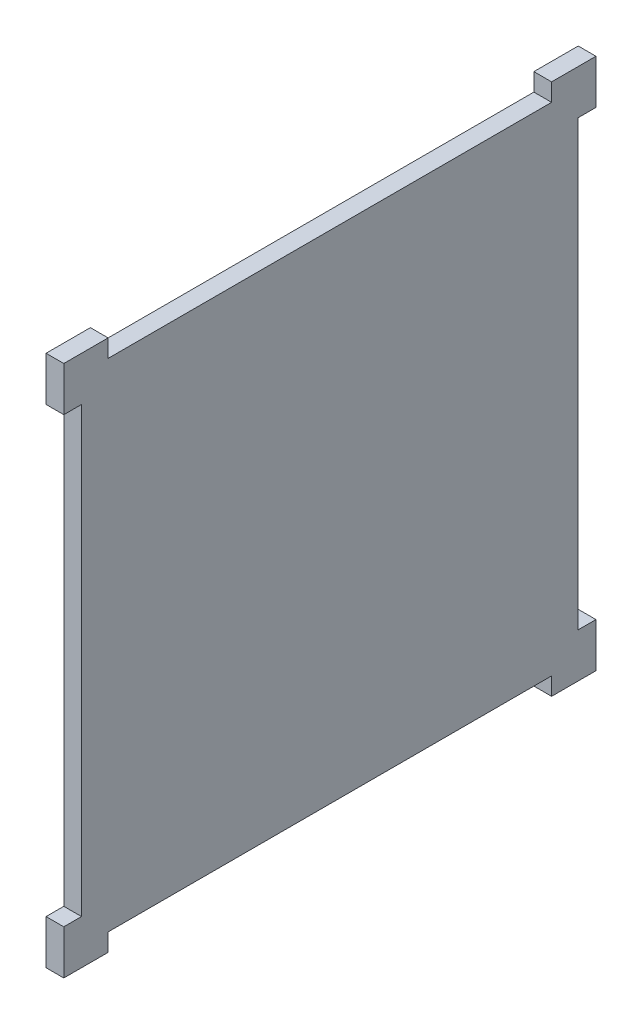
ISO-10303-21;
HEADER;
FILE_DESCRIPTION(('STEP AP214'),'2;1');
FILE_NAME('part.step','',(''),(''),'','','');
FILE_SCHEMA(('AUTOMOTIVE_DESIGN { 1 0 10303 214 1 1 1 1 }'));
ENDSEC;
DATA;
#1=APPLICATION_CONTEXT('core data for automotive mechanical design processes');
#2=APPLICATION_PROTOCOL_DEFINITION('international standard','automotive_design',2000,#1);
#3=PRODUCT_CONTEXT('',#1,'mechanical');
#4=PRODUCT('Part','Part','',(#3));
#5=PRODUCT_RELATED_PRODUCT_CATEGORY('part','',(#4));
#6=PRODUCT_DEFINITION_FORMATION('','',#4);
#7=PRODUCT_DEFINITION_CONTEXT('part definition',#1,'design');
#8=PRODUCT_DEFINITION('design','',#6,#7);
#9=PRODUCT_DEFINITION_SHAPE('','',#8);
#10=(LENGTH_UNIT() NAMED_UNIT(*) SI_UNIT(.MILLI.,.METRE.));
#11=(NAMED_UNIT(*) PLANE_ANGLE_UNIT() SI_UNIT($,.RADIAN.));
#12=(NAMED_UNIT(*) SI_UNIT($,.STERADIAN.) SOLID_ANGLE_UNIT());
#13=UNCERTAINTY_MEASURE_WITH_UNIT(LENGTH_MEASURE(1.E-05),#10,'distance_accuracy_value','');
#14=(GEOMETRIC_REPRESENTATION_CONTEXT(3) GLOBAL_UNCERTAINTY_ASSIGNED_CONTEXT((#13)) GLOBAL_UNIT_ASSIGNED_CONTEXT((#10,
#11,#12)) REPRESENTATION_CONTEXT('',''));
#15=CARTESIAN_POINT('',(0.,0.,0.));
#16=DIRECTION('',(0.,0.,1.));
#17=DIRECTION('',(1.,0.,0.));
#18=AXIS2_PLACEMENT_3D('',#15,#16,#17);
#19=CARTESIAN_POINT('',(5.08,63.5,-76.2));
#20=DIRECTION('',(0.,0.,1.));
#21=DIRECTION('',(0.,-1.,0.));
#22=AXIS2_PLACEMENT_3D('',#19,#20,#21);
#23=PLANE('',#22);
#24=DIRECTION('',(0.,1.,0.));
#25=VECTOR('',#24,1.);
#26=CARTESIAN_POINT('',(0.,63.5,-76.2));
#27=LINE('',#26,#25);
#28=CARTESIAN_POINT('',(0.,63.5,-76.2));
#29=VERTEX_POINT('',#28);
#30=CARTESIAN_POINT('',(0.,76.2,-76.2));
#31=VERTEX_POINT('',#30);
#32=EDGE_CURVE('E201',#29,#31,#27,.T.);
#33=ORIENTED_EDGE('',*,*,#32,.T.);
#34=DIRECTION('',(-1.,0.,0.));
#35=VECTOR('',#34,1.);
#36=CARTESIAN_POINT('',(5.08,76.2,-76.2));
#37=LINE('',#36,#35);
#38=CARTESIAN_POINT('',(5.08,76.2,-76.2));
#39=VERTEX_POINT('',#38);
#40=EDGE_CURVE('E11',#39,#31,#37,.T.);
#41=ORIENTED_EDGE('',*,*,#40,.F.);
#42=DIRECTION('',(0.,1.,0.));
#43=VECTOR('',#42,1.);
#44=CARTESIAN_POINT('',(5.08,63.5,-76.2));
#45=LINE('',#44,#43);
#46=CARTESIAN_POINT('',(5.08,63.5,-76.2));
#47=VERTEX_POINT('',#46);
#48=EDGE_CURVE('E239',#47,#39,#45,.T.);
#49=ORIENTED_EDGE('',*,*,#48,.F.);
#50=DIRECTION('',(-1.,0.,0.));
#51=VECTOR('',#50,1.);
#52=CARTESIAN_POINT('',(5.08,63.5,-76.2));
#53=LINE('',#52,#51);
#54=EDGE_CURVE('E197',#47,#29,#53,.T.);
#55=ORIENTED_EDGE('',*,*,#54,.T.);
#56=EDGE_LOOP('',(#33,#41,#49,#55));
#57=FACE_BOUND('',#56,.T.);
#58=ADVANCED_FACE('F33',(#57),#23,.F.);
#59=CARTESIAN_POINT('',(5.08,76.2,-63.5));
#60=DIRECTION('',(0.,-1.,0.));
#61=DIRECTION('',(0.,0.,-1.));
#62=AXIS2_PLACEMENT_3D('',#59,#60,#61);
#63=PLANE('',#62);
#64=DIRECTION('',(0.,0.,1.));
#65=VECTOR('',#64,1.);
#66=CARTESIAN_POINT('',(0.,76.2,-63.5));
#67=LINE('',#66,#65);
#68=CARTESIAN_POINT('',(0.,76.2,-63.5));
#69=VERTEX_POINT('',#68);
#70=EDGE_CURVE('E204',#31,#69,#67,.T.);
#71=ORIENTED_EDGE('',*,*,#70,.T.);
#72=DIRECTION('',(-1.,0.,0.));
#73=VECTOR('',#72,1.);
#74=CARTESIAN_POINT('',(5.08,76.2,-63.5));
#75=LINE('',#74,#73);
#76=CARTESIAN_POINT('',(5.08,76.2,-63.5));
#77=VERTEX_POINT('',#76);
#78=EDGE_CURVE('E41',#77,#69,#75,.T.);
#79=ORIENTED_EDGE('',*,*,#78,.F.);
#80=DIRECTION('',(0.,0.,1.));
#81=VECTOR('',#80,1.);
#82=CARTESIAN_POINT('',(5.08,76.2,-63.5));
#83=LINE('',#82,#81);
#84=EDGE_CURVE('E128',#39,#77,#83,.T.);
#85=ORIENTED_EDGE('',*,*,#84,.F.);
#86=ORIENTED_EDGE('',*,*,#40,.T.);
#87=EDGE_LOOP('',(#71,#79,#85,#86));
#88=FACE_BOUND('',#87,.T.);
#89=ADVANCED_FACE('F357',(#88),#63,.F.);
#90=CARTESIAN_POINT('',(5.08,76.2,-63.5));
#91=DIRECTION('',(0.,0.,-1.));
#92=DIRECTION('',(-1.,0.,0.));
#93=AXIS2_PLACEMENT_3D('',#90,#91,#92);
#94=PLANE('',#93);
#95=DIRECTION('',(0.,-1.,0.));
#96=VECTOR('',#95,1.);
#97=CARTESIAN_POINT('',(0.,76.2,-63.5));
#98=LINE('',#97,#96);
#99=CARTESIAN_POINT('',(0.,71.12,-63.5));
#100=VERTEX_POINT('',#99);
#101=EDGE_CURVE('E206',#69,#100,#98,.T.);
#102=ORIENTED_EDGE('',*,*,#101,.T.);
#103=DIRECTION('',(-1.,0.,0.));
#104=VECTOR('',#103,1.);
#105=CARTESIAN_POINT('',(5.08,71.12,-63.5));
#106=LINE('',#105,#104);
#107=CARTESIAN_POINT('',(5.08,71.12,-63.5));
#108=VERTEX_POINT('',#107);
#109=EDGE_CURVE('E282',#108,#100,#106,.T.);
#110=ORIENTED_EDGE('',*,*,#109,.F.);
#111=DIRECTION('',(0.,-1.,0.));
#112=VECTOR('',#111,1.);
#113=CARTESIAN_POINT('',(5.08,76.2,-63.5));
#114=LINE('',#113,#112);
#115=EDGE_CURVE('E290',#77,#108,#114,.T.);
#116=ORIENTED_EDGE('',*,*,#115,.F.);
#117=ORIENTED_EDGE('',*,*,#78,.T.);
#118=EDGE_LOOP('',(#102,#110,#116,#117));
#119=FACE_BOUND('',#118,.T.);
#120=ADVANCED_FACE('F288',(#119),#94,.F.);
#121=CARTESIAN_POINT('',(5.08,71.12,63.5));
#122=DIRECTION('',(0.,-1.,0.));
#123=DIRECTION('',(0.,0.,-1.));
#124=AXIS2_PLACEMENT_3D('',#121,#122,#123);
#125=PLANE('',#124);
#126=DIRECTION('',(0.,0.,1.));
#127=VECTOR('',#126,1.);
#128=CARTESIAN_POINT('',(0.,71.12,63.5));
#129=LINE('',#128,#127);
#130=CARTESIAN_POINT('',(0.,71.12,63.5));
#131=VERTEX_POINT('',#130);
#132=EDGE_CURVE('E208',#100,#131,#129,.T.);
#133=ORIENTED_EDGE('',*,*,#132,.T.);
#134=DIRECTION('',(-1.,0.,0.));
#135=VECTOR('',#134,1.);
#136=CARTESIAN_POINT('',(5.08,71.12,63.5));
#137=LINE('',#136,#135);
#138=CARTESIAN_POINT('',(5.08,71.12,63.5));
#139=VERTEX_POINT('',#138);
#140=EDGE_CURVE('E279',#139,#131,#137,.T.);
#141=ORIENTED_EDGE('',*,*,#140,.F.);
#142=DIRECTION('',(0.,0.,1.));
#143=VECTOR('',#142,1.);
#144=CARTESIAN_POINT('',(5.08,71.12,63.5));
#145=LINE('',#144,#143);
#146=EDGE_CURVE('E308',#108,#139,#145,.T.);
#147=ORIENTED_EDGE('',*,*,#146,.F.);
#148=ORIENTED_EDGE('',*,*,#109,.T.);
#149=EDGE_LOOP('',(#133,#141,#147,#148));
#150=FACE_BOUND('',#149,.T.);
#151=ADVANCED_FACE('F299',(#150),#125,.F.);
#152=CARTESIAN_POINT('',(5.08,76.2,63.5));
#153=DIRECTION('',(0.,0.,1.));
#154=DIRECTION('',(1.,0.,0.));
#155=AXIS2_PLACEMENT_3D('',#152,#153,#154);
#156=PLANE('',#155);
#157=DIRECTION('',(0.,1.,0.));
#158=VECTOR('',#157,1.);
#159=CARTESIAN_POINT('',(0.,76.2,63.5));
#160=LINE('',#159,#158);
#161=CARTESIAN_POINT('',(0.,76.2,63.5));
#162=VERTEX_POINT('',#161);
#163=EDGE_CURVE('E210',#131,#162,#160,.T.);
#164=ORIENTED_EDGE('',*,*,#163,.T.);
#165=DIRECTION('',(-1.,0.,0.));
#166=VECTOR('',#165,1.);
#167=CARTESIAN_POINT('',(5.08,76.2,63.5));
#168=LINE('',#167,#166);
#169=CARTESIAN_POINT('',(5.08,76.2,63.5));
#170=VERTEX_POINT('',#169);
#171=EDGE_CURVE('E276',#170,#162,#168,.T.);
#172=ORIENTED_EDGE('',*,*,#171,.F.);
#173=DIRECTION('',(0.,1.,0.));
#174=VECTOR('',#173,1.);
#175=CARTESIAN_POINT('',(5.08,76.2,63.5));
#176=LINE('',#175,#174);
#177=EDGE_CURVE('E305',#139,#170,#176,.T.);
#178=ORIENTED_EDGE('',*,*,#177,.F.);
#179=ORIENTED_EDGE('',*,*,#140,.T.);
#180=EDGE_LOOP('',(#164,#172,#178,#179));
#181=FACE_BOUND('',#180,.T.);
#182=ADVANCED_FACE('F303',(#181),#156,.F.);
#183=CARTESIAN_POINT('',(5.08,76.2,76.2));
#184=DIRECTION('',(0.,-1.,0.));
#185=DIRECTION('',(0.,0.,-1.));
#186=AXIS2_PLACEMENT_3D('',#183,#184,#185);
#187=PLANE('',#186);
#188=DIRECTION('',(0.,0.,1.));
#189=VECTOR('',#188,1.);
#190=CARTESIAN_POINT('',(0.,76.2,76.2));
#191=LINE('',#190,#189);
#192=CARTESIAN_POINT('',(0.,76.2,76.2));
#193=VERTEX_POINT('',#192);
#194=EDGE_CURVE('E212',#162,#193,#191,.T.);
#195=ORIENTED_EDGE('',*,*,#194,.T.);
#196=DIRECTION('',(-1.,0.,0.));
#197=VECTOR('',#196,1.);
#198=CARTESIAN_POINT('',(5.08,76.2,76.2));
#199=LINE('',#198,#197);
#200=CARTESIAN_POINT('',(5.08,76.2,76.2));
#201=VERTEX_POINT('',#200);
#202=EDGE_CURVE('E273',#201,#193,#199,.T.);
#203=ORIENTED_EDGE('',*,*,#202,.F.);
#204=DIRECTION('',(0.,0.,1.));
#205=VECTOR('',#204,1.);
#206=CARTESIAN_POINT('',(5.08,76.2,76.2));
#207=LINE('',#206,#205);
#208=EDGE_CURVE('E307',#170,#201,#207,.T.);
#209=ORIENTED_EDGE('',*,*,#208,.F.);
#210=ORIENTED_EDGE('',*,*,#171,.T.);
#211=EDGE_LOOP('',(#195,#203,#209,#210));
#212=FACE_BOUND('',#211,.T.);
#213=ADVANCED_FACE('F370',(#212),#187,.F.);
#214=CARTESIAN_POINT('',(5.08,63.5,76.2));
#215=DIRECTION('',(0.,0.,-1.));
#216=DIRECTION('',(-1.,0.,0.));
#217=AXIS2_PLACEMENT_3D('',#214,#215,#216);
#218=PLANE('',#217);
#219=DIRECTION('',(0.,-1.,0.));
#220=VECTOR('',#219,1.);
#221=CARTESIAN_POINT('',(0.,63.5,76.2));
#222=LINE('',#221,#220);
#223=CARTESIAN_POINT('',(0.,63.5,76.2));
#224=VERTEX_POINT('',#223);
#225=EDGE_CURVE('E214',#193,#224,#222,.T.);
#226=ORIENTED_EDGE('',*,*,#225,.T.);
#227=DIRECTION('',(-1.,0.,0.));
#228=VECTOR('',#227,1.);
#229=CARTESIAN_POINT('',(5.08,63.5,76.2));
#230=LINE('',#229,#228);
#231=CARTESIAN_POINT('',(5.08,63.5,76.2));
#232=VERTEX_POINT('',#231);
#233=EDGE_CURVE('E270',#232,#224,#230,.T.);
#234=ORIENTED_EDGE('',*,*,#233,.F.);
#235=DIRECTION('',(0.,-1.,0.));
#236=VECTOR('',#235,1.);
#237=CARTESIAN_POINT('',(5.08,63.5,76.2));
#238=LINE('',#237,#236);
#239=EDGE_CURVE('E310',#201,#232,#238,.T.);
#240=ORIENTED_EDGE('',*,*,#239,.F.);
#241=ORIENTED_EDGE('',*,*,#202,.T.);
#242=EDGE_LOOP('',(#226,#234,#240,#241));
#243=FACE_BOUND('',#242,.T.);
#244=ADVANCED_FACE('F373',(#243),#218,.F.);
#245=CARTESIAN_POINT('',(5.08,63.5,76.2));
#246=DIRECTION('',(0.,1.,0.));
#247=DIRECTION('',(0.,0.,1.));
#248=AXIS2_PLACEMENT_3D('',#245,#246,#247);
#249=PLANE('',#248);
#250=DIRECTION('',(0.,0.,-1.));
#251=VECTOR('',#250,1.);
#252=CARTESIAN_POINT('',(0.,63.5,76.2));
#253=LINE('',#252,#251);
#254=CARTESIAN_POINT('',(0.,63.5,71.12));
#255=VERTEX_POINT('',#254);
#256=EDGE_CURVE('E216',#224,#255,#253,.T.);
#257=ORIENTED_EDGE('',*,*,#256,.T.);
#258=DIRECTION('',(-1.,0.,0.));
#259=VECTOR('',#258,1.);
#260=CARTESIAN_POINT('',(5.08,63.5,71.12));
#261=LINE('',#260,#259);
#262=CARTESIAN_POINT('',(5.08,63.5,71.12));
#263=VERTEX_POINT('',#262);
#264=EDGE_CURVE('E267',#263,#255,#261,.T.);
#265=ORIENTED_EDGE('',*,*,#264,.F.);
#266=DIRECTION('',(0.,0.,-1.));
#267=VECTOR('',#266,1.);
#268=CARTESIAN_POINT('',(5.08,63.5,76.2));
#269=LINE('',#268,#267);
#270=EDGE_CURVE('E316',#232,#263,#269,.T.);
#271=ORIENTED_EDGE('',*,*,#270,.F.);
#272=ORIENTED_EDGE('',*,*,#233,.T.);
#273=EDGE_LOOP('',(#257,#265,#271,#272));
#274=FACE_BOUND('',#273,.T.);
#275=ADVANCED_FACE('F377',(#274),#249,.F.);
#276=CARTESIAN_POINT('',(5.08,-63.5,71.12));
#277=DIRECTION('',(0.,0.,-1.));
#278=DIRECTION('',(0.,1.,0.));
#279=AXIS2_PLACEMENT_3D('',#276,#277,#278);
#280=PLANE('',#279);
#281=DIRECTION('',(0.,-1.,0.));
#282=VECTOR('',#281,1.);
#283=CARTESIAN_POINT('',(0.,-63.5,71.12));
#284=LINE('',#283,#282);
#285=CARTESIAN_POINT('',(0.,-63.5,71.12));
#286=VERTEX_POINT('',#285);
#287=EDGE_CURVE('E218',#255,#286,#284,.T.);
#288=ORIENTED_EDGE('',*,*,#287,.T.);
#289=DIRECTION('',(-1.,0.,0.));
#290=VECTOR('',#289,1.);
#291=CARTESIAN_POINT('',(5.08,-63.5,71.12));
#292=LINE('',#291,#290);
#293=CARTESIAN_POINT('',(5.08,-63.5,71.12));
#294=VERTEX_POINT('',#293);
#295=EDGE_CURVE('E264',#294,#286,#292,.T.);
#296=ORIENTED_EDGE('',*,*,#295,.F.);
#297=DIRECTION('',(0.,-1.,0.));
#298=VECTOR('',#297,1.);
#299=CARTESIAN_POINT('',(5.08,-63.5,71.12));
#300=LINE('',#299,#298);
#301=EDGE_CURVE('E318',#263,#294,#300,.T.);
#302=ORIENTED_EDGE('',*,*,#301,.F.);
#303=ORIENTED_EDGE('',*,*,#264,.T.);
#304=EDGE_LOOP('',(#288,#296,#302,#303));
#305=FACE_BOUND('',#304,.T.);
#306=ADVANCED_FACE('F381',(#305),#280,.F.);
#307=CARTESIAN_POINT('',(5.08,-63.5,76.2));
#308=DIRECTION('',(0.,-1.,0.));
#309=DIRECTION('',(0.,0.,-1.));
#310=AXIS2_PLACEMENT_3D('',#307,#308,#309);
#311=PLANE('',#310);
#312=DIRECTION('',(0.,0.,1.));
#313=VECTOR('',#312,1.);
#314=CARTESIAN_POINT('',(0.,-63.5,76.2));
#315=LINE('',#314,#313);
#316=CARTESIAN_POINT('',(0.,-63.5,76.2));
#317=VERTEX_POINT('',#316);
#318=EDGE_CURVE('E220',#286,#317,#315,.T.);
#319=ORIENTED_EDGE('',*,*,#318,.T.);
#320=DIRECTION('',(-1.,0.,0.));
#321=VECTOR('',#320,1.);
#322=CARTESIAN_POINT('',(5.08,-63.5,76.2));
#323=LINE('',#322,#321);
#324=CARTESIAN_POINT('',(5.08,-63.5,76.2));
#325=VERTEX_POINT('',#324);
#326=EDGE_CURVE('E261',#325,#317,#323,.T.);
#327=ORIENTED_EDGE('',*,*,#326,.F.);
#328=DIRECTION('',(0.,0.,1.));
#329=VECTOR('',#328,1.);
#330=CARTESIAN_POINT('',(5.08,-63.5,76.2));
#331=LINE('',#330,#329);
#332=EDGE_CURVE('E320',#294,#325,#331,.T.);
#333=ORIENTED_EDGE('',*,*,#332,.F.);
#334=ORIENTED_EDGE('',*,*,#295,.T.);
#335=EDGE_LOOP('',(#319,#327,#333,#334));
#336=FACE_BOUND('',#335,.T.);
#337=ADVANCED_FACE('F385',(#336),#311,.F.);
#338=CARTESIAN_POINT('',(5.08,-76.2,76.2));
#339=DIRECTION('',(0.,0.,-1.));
#340=DIRECTION('',(0.,1.,0.));
#341=AXIS2_PLACEMENT_3D('',#338,#339,#340);
#342=PLANE('',#341);
#343=DIRECTION('',(0.,-1.,0.));
#344=VECTOR('',#343,1.);
#345=CARTESIAN_POINT('',(0.,-76.2,76.2));
#346=LINE('',#345,#344);
#347=CARTESIAN_POINT('',(0.,-76.2,76.2));
#348=VERTEX_POINT('',#347);
#349=EDGE_CURVE('E222',#317,#348,#346,.T.);
#350=ORIENTED_EDGE('',*,*,#349,.T.);
#351=DIRECTION('',(-1.,0.,0.));
#352=VECTOR('',#351,1.);
#353=CARTESIAN_POINT('',(5.08,-76.2,76.2));
#354=LINE('',#353,#352);
#355=CARTESIAN_POINT('',(5.08,-76.2,76.2));
#356=VERTEX_POINT('',#355);
#357=EDGE_CURVE('E258',#356,#348,#354,.T.);
#358=ORIENTED_EDGE('',*,*,#357,.F.);
#359=DIRECTION('',(0.,-1.,0.));
#360=VECTOR('',#359,1.);
#361=CARTESIAN_POINT('',(5.08,-76.2,76.2));
#362=LINE('',#361,#360);
#363=EDGE_CURVE('E322',#325,#356,#362,.T.);
#364=ORIENTED_EDGE('',*,*,#363,.F.);
#365=ORIENTED_EDGE('',*,*,#326,.T.);
#366=EDGE_LOOP('',(#350,#358,#364,#365));
#367=FACE_BOUND('',#366,.T.);
#368=ADVANCED_FACE('F389',(#367),#342,.F.);
#369=CARTESIAN_POINT('',(5.08,-76.2,76.2));
#370=DIRECTION('',(0.,1.,0.));
#371=DIRECTION('',(0.,0.,1.));
#372=AXIS2_PLACEMENT_3D('',#369,#370,#371);
#373=PLANE('',#372);
#374=DIRECTION('',(0.,0.,-1.));
#375=VECTOR('',#374,1.);
#376=CARTESIAN_POINT('',(0.,-76.2,76.2));
#377=LINE('',#376,#375);
#378=CARTESIAN_POINT('',(0.,-76.2,63.5));
#379=VERTEX_POINT('',#378);
#380=EDGE_CURVE('E224',#348,#379,#377,.T.);
#381=ORIENTED_EDGE('',*,*,#380,.T.);
#382=DIRECTION('',(-1.,0.,0.));
#383=VECTOR('',#382,1.);
#384=CARTESIAN_POINT('',(5.08,-76.2,63.5));
#385=LINE('',#384,#383);
#386=CARTESIAN_POINT('',(5.08,-76.2,63.5));
#387=VERTEX_POINT('',#386);
#388=EDGE_CURVE('E255',#387,#379,#385,.T.);
#389=ORIENTED_EDGE('',*,*,#388,.F.);
#390=DIRECTION('',(0.,0.,-1.));
#391=VECTOR('',#390,1.);
#392=CARTESIAN_POINT('',(5.08,-76.2,76.2));
#393=LINE('',#392,#391);
#394=EDGE_CURVE('E324',#356,#387,#393,.T.);
#395=ORIENTED_EDGE('',*,*,#394,.F.);
#396=ORIENTED_EDGE('',*,*,#357,.T.);
#397=EDGE_LOOP('',(#381,#389,#395,#396));
#398=FACE_BOUND('',#397,.T.);
#399=ADVANCED_FACE('F393',(#398),#373,.F.);
#400=CARTESIAN_POINT('',(5.08,-76.2,63.5));
#401=DIRECTION('',(0.,0.,1.));
#402=DIRECTION('',(1.,0.,0.));
#403=AXIS2_PLACEMENT_3D('',#400,#401,#402);
#404=PLANE('',#403);
#405=DIRECTION('',(0.,1.,0.));
#406=VECTOR('',#405,1.);
#407=CARTESIAN_POINT('',(0.,-76.2,63.5));
#408=LINE('',#407,#406);
#409=CARTESIAN_POINT('',(0.,-71.12,63.5));
#410=VERTEX_POINT('',#409);
#411=EDGE_CURVE('E226',#379,#410,#408,.T.);
#412=ORIENTED_EDGE('',*,*,#411,.T.);
#413=DIRECTION('',(-1.,0.,0.));
#414=VECTOR('',#413,1.);
#415=CARTESIAN_POINT('',(5.08,-71.12,63.5));
#416=LINE('',#415,#414);
#417=CARTESIAN_POINT('',(5.08,-71.12,63.5));
#418=VERTEX_POINT('',#417);
#419=EDGE_CURVE('E252',#418,#410,#416,.T.);
#420=ORIENTED_EDGE('',*,*,#419,.F.);
#421=DIRECTION('',(0.,1.,0.));
#422=VECTOR('',#421,1.);
#423=CARTESIAN_POINT('',(5.08,-76.2,63.5));
#424=LINE('',#423,#422);
#425=EDGE_CURVE('E326',#387,#418,#424,.T.);
#426=ORIENTED_EDGE('',*,*,#425,.F.);
#427=ORIENTED_EDGE('',*,*,#388,.T.);
#428=EDGE_LOOP('',(#412,#420,#426,#427));
#429=FACE_BOUND('',#428,.T.);
#430=ADVANCED_FACE('F397',(#429),#404,.F.);
#431=CARTESIAN_POINT('',(5.08,-71.12,63.5));
#432=DIRECTION('',(0.,1.,0.));
#433=DIRECTION('',(0.,0.,1.));
#434=AXIS2_PLACEMENT_3D('',#431,#432,#433);
#435=PLANE('',#434);
#436=DIRECTION('',(0.,0.,-1.));
#437=VECTOR('',#436,1.);
#438=CARTESIAN_POINT('',(0.,-71.12,63.5));
#439=LINE('',#438,#437);
#440=CARTESIAN_POINT('',(0.,-71.12,-63.4999999999999));
#441=VERTEX_POINT('',#440);
#442=EDGE_CURVE('E228',#410,#441,#439,.T.);
#443=ORIENTED_EDGE('',*,*,#442,.T.);
#444=DIRECTION('',(-1.,0.,0.));
#445=VECTOR('',#444,1.);
#446=CARTESIAN_POINT('',(5.08,-71.12,-63.4999999999999));
#447=LINE('',#446,#445);
#448=CARTESIAN_POINT('',(5.08,-71.12,-63.4999999999999));
#449=VERTEX_POINT('',#448);
#450=EDGE_CURVE('E249',#449,#441,#447,.T.);
#451=ORIENTED_EDGE('',*,*,#450,.F.);
#452=DIRECTION('',(0.,0.,-1.));
#453=VECTOR('',#452,1.);
#454=CARTESIAN_POINT('',(5.08,-71.12,63.5));
#455=LINE('',#454,#453);
#456=EDGE_CURVE('E328',#418,#449,#455,.T.);
#457=ORIENTED_EDGE('',*,*,#456,.F.);
#458=ORIENTED_EDGE('',*,*,#419,.T.);
#459=EDGE_LOOP('',(#443,#451,#457,#458));
#460=FACE_BOUND('',#459,.T.);
#461=ADVANCED_FACE('F401',(#460),#435,.F.);
#462=CARTESIAN_POINT('',(5.08,-76.2,-63.4999999999999));
#463=DIRECTION('',(0.,0.,-1.));
#464=DIRECTION('',(-1.,0.,0.));
#465=AXIS2_PLACEMENT_3D('',#462,#463,#464);
#466=PLANE('',#465);
#467=DIRECTION('',(0.,-1.,0.));
#468=VECTOR('',#467,1.);
#469=CARTESIAN_POINT('',(0.,-76.2,-63.4999999999999));
#470=LINE('',#469,#468);
#471=CARTESIAN_POINT('',(0.,-76.2,-63.4999999999999));
#472=VERTEX_POINT('',#471);
#473=EDGE_CURVE('E230',#441,#472,#470,.T.);
#474=ORIENTED_EDGE('',*,*,#473,.T.);
#475=DIRECTION('',(-1.,0.,0.));
#476=VECTOR('',#475,1.);
#477=CARTESIAN_POINT('',(5.08,-76.2,-63.4999999999999));
#478=LINE('',#477,#476);
#479=CARTESIAN_POINT('',(5.08,-76.2,-63.4999999999999));
#480=VERTEX_POINT('',#479);
#481=EDGE_CURVE('E246',#480,#472,#478,.T.);
#482=ORIENTED_EDGE('',*,*,#481,.F.);
#483=DIRECTION('',(0.,-1.,0.));
#484=VECTOR('',#483,1.);
#485=CARTESIAN_POINT('',(5.08,-76.2,-63.4999999999999));
#486=LINE('',#485,#484);
#487=EDGE_CURVE('E330',#449,#480,#486,.T.);
#488=ORIENTED_EDGE('',*,*,#487,.F.);
#489=ORIENTED_EDGE('',*,*,#450,.T.);
#490=EDGE_LOOP('',(#474,#482,#488,#489));
#491=FACE_BOUND('',#490,.T.);
#492=ADVANCED_FACE('F405',(#491),#466,.F.);
#493=CARTESIAN_POINT('',(5.08,-76.2,-63.4999999999999));
#494=DIRECTION('',(0.,1.,0.));
#495=DIRECTION('',(0.,0.,1.));
#496=AXIS2_PLACEMENT_3D('',#493,#494,#495);
#497=PLANE('',#496);
#498=DIRECTION('',(0.,0.,-1.));
#499=VECTOR('',#498,1.);
#500=CARTESIAN_POINT('',(0.,-76.2,-63.4999999999999));
#501=LINE('',#500,#499);
#502=CARTESIAN_POINT('',(0.,-76.2,-76.2));
#503=VERTEX_POINT('',#502);
#504=EDGE_CURVE('E232',#472,#503,#501,.T.);
#505=ORIENTED_EDGE('',*,*,#504,.T.);
#506=DIRECTION('',(-1.,0.,0.));
#507=VECTOR('',#506,1.);
#508=CARTESIAN_POINT('',(5.08,-76.2,-76.2));
#509=LINE('',#508,#507);
#510=CARTESIAN_POINT('',(5.08,-76.2,-76.2));
#511=VERTEX_POINT('',#510);
#512=EDGE_CURVE('E243',#511,#503,#509,.T.);
#513=ORIENTED_EDGE('',*,*,#512,.F.);
#514=DIRECTION('',(0.,0.,-1.));
#515=VECTOR('',#514,1.);
#516=CARTESIAN_POINT('',(5.08,-76.2,-63.4999999999999));
#517=LINE('',#516,#515);
#518=EDGE_CURVE('E332',#480,#511,#517,.T.);
#519=ORIENTED_EDGE('',*,*,#518,.F.);
#520=ORIENTED_EDGE('',*,*,#481,.T.);
#521=EDGE_LOOP('',(#505,#513,#519,#520));
#522=FACE_BOUND('',#521,.T.);
#523=ADVANCED_FACE('F338',(#522),#497,.F.);
#524=CARTESIAN_POINT('',(5.08,-76.2,-76.2));
#525=DIRECTION('',(0.,0.,1.));
#526=DIRECTION('',(0.,-1.,0.));
#527=AXIS2_PLACEMENT_3D('',#524,#525,#526);
#528=PLANE('',#527);
#529=DIRECTION('',(0.,1.,0.));
#530=VECTOR('',#529,1.);
#531=CARTESIAN_POINT('',(0.,-76.2,-76.2));
#532=LINE('',#531,#530);
#533=CARTESIAN_POINT('',(0.,-63.5,-76.2));
#534=VERTEX_POINT('',#533);
#535=EDGE_CURVE('E234',#503,#534,#532,.T.);
#536=ORIENTED_EDGE('',*,*,#535,.T.);
#537=DIRECTION('',(-1.,0.,0.));
#538=VECTOR('',#537,1.);
#539=CARTESIAN_POINT('',(5.08,-63.5,-76.2));
#540=LINE('',#539,#538);
#541=CARTESIAN_POINT('',(5.08,-63.5,-76.2));
#542=VERTEX_POINT('',#541);
#543=EDGE_CURVE('E192',#542,#534,#540,.T.);
#544=ORIENTED_EDGE('',*,*,#543,.F.);
#545=DIRECTION('',(0.,1.,0.));
#546=VECTOR('',#545,1.);
#547=CARTESIAN_POINT('',(5.08,-76.2,-76.2));
#548=LINE('',#547,#546);
#549=EDGE_CURVE('E183',#511,#542,#548,.T.);
#550=ORIENTED_EDGE('',*,*,#549,.F.);
#551=ORIENTED_EDGE('',*,*,#512,.T.);
#552=EDGE_LOOP('',(#536,#544,#550,#551));
#553=FACE_BOUND('',#552,.T.);
#554=ADVANCED_FACE('F342',(#553),#528,.F.);
#555=CARTESIAN_POINT('',(5.08,-63.5,-76.2));
#556=DIRECTION('',(0.,-1.,0.));
#557=DIRECTION('',(0.,0.,-1.));
#558=AXIS2_PLACEMENT_3D('',#555,#556,#557);
#559=PLANE('',#558);
#560=DIRECTION('',(0.,0.,1.));
#561=VECTOR('',#560,1.);
#562=CARTESIAN_POINT('',(0.,-63.5,-76.2));
#563=LINE('',#562,#561);
#564=CARTESIAN_POINT('',(0.,-63.5,-71.12));
#565=VERTEX_POINT('',#564);
#566=EDGE_CURVE('E191',#534,#565,#563,.T.);
#567=ORIENTED_EDGE('',*,*,#566,.T.);
#568=DIRECTION('',(-1.,0.,0.));
#569=VECTOR('',#568,1.);
#570=CARTESIAN_POINT('',(5.08,-63.5,-71.12));
#571=LINE('',#570,#569);
#572=CARTESIAN_POINT('',(5.08,-63.5,-71.12));
#573=VERTEX_POINT('',#572);
#574=EDGE_CURVE('E188',#573,#565,#571,.T.);
#575=ORIENTED_EDGE('',*,*,#574,.F.);
#576=DIRECTION('',(0.,0.,1.));
#577=VECTOR('',#576,1.);
#578=CARTESIAN_POINT('',(5.08,-63.5,-76.2));
#579=LINE('',#578,#577);
#580=EDGE_CURVE('E177',#542,#573,#579,.T.);
#581=ORIENTED_EDGE('',*,*,#580,.F.);
#582=ORIENTED_EDGE('',*,*,#543,.T.);
#583=EDGE_LOOP('',(#567,#575,#581,#582));
#584=FACE_BOUND('',#583,.T.);
#585=ADVANCED_FACE('F189',(#584),#559,.F.);
#586=CARTESIAN_POINT('',(5.08,-63.5,-71.12));
#587=DIRECTION('',(0.,0.,1.));
#588=DIRECTION('',(0.,-1.,0.));
#589=AXIS2_PLACEMENT_3D('',#586,#587,#588);
#590=PLANE('',#589);
#591=DIRECTION('',(0.,1.,0.));
#592=VECTOR('',#591,1.);
#593=CARTESIAN_POINT('',(0.,-63.5,-71.12));
#594=LINE('',#593,#592);
#595=CARTESIAN_POINT('',(0.,63.5,-71.12));
#596=VERTEX_POINT('',#595);
#597=EDGE_CURVE('E114',#565,#596,#594,.T.);
#598=ORIENTED_EDGE('',*,*,#597,.T.);
#599=DIRECTION('',(-1.,0.,0.));
#600=VECTOR('',#599,1.);
#601=CARTESIAN_POINT('',(5.08,63.5,-71.12));
#602=LINE('',#601,#600);
#603=CARTESIAN_POINT('',(5.08,63.5,-71.12));
#604=VERTEX_POINT('',#603);
#605=EDGE_CURVE('E193',#604,#596,#602,.T.);
#606=ORIENTED_EDGE('',*,*,#605,.F.);
#607=DIRECTION('',(0.,1.,0.));
#608=VECTOR('',#607,1.);
#609=CARTESIAN_POINT('',(5.08,-63.5,-71.12));
#610=LINE('',#609,#608);
#611=EDGE_CURVE('E181',#573,#604,#610,.T.);
#612=ORIENTED_EDGE('',*,*,#611,.F.);
#613=ORIENTED_EDGE('',*,*,#574,.T.);
#614=EDGE_LOOP('',(#598,#606,#612,#613));
#615=FACE_BOUND('',#614,.T.);
#616=ADVANCED_FACE('F195',(#615),#590,.F.);
#617=CARTESIAN_POINT('',(5.08,63.5,-76.2));
#618=DIRECTION('',(0.,1.,0.));
#619=DIRECTION('',(0.,0.,1.));
#620=AXIS2_PLACEMENT_3D('',#617,#618,#619);
#621=PLANE('',#620);
#622=DIRECTION('',(0.,0.,-1.));
#623=VECTOR('',#622,1.);
#624=CARTESIAN_POINT('',(0.,63.5,-76.2));
#625=LINE('',#624,#623);
#626=EDGE_CURVE('E120',#596,#29,#625,.T.);
#627=ORIENTED_EDGE('',*,*,#626,.T.);
#628=ORIENTED_EDGE('',*,*,#54,.F.);
#629=DIRECTION('',(0.,0.,-1.));
#630=VECTOR('',#629,1.);
#631=CARTESIAN_POINT('',(5.08,63.5,-76.2));
#632=LINE('',#631,#630);
#633=EDGE_CURVE('E49',#604,#47,#632,.T.);
#634=ORIENTED_EDGE('',*,*,#633,.F.);
#635=ORIENTED_EDGE('',*,*,#605,.T.);
#636=EDGE_LOOP('',(#627,#628,#634,#635));
#637=FACE_BOUND('',#636,.T.);
#638=ADVANCED_FACE('F346',(#637),#621,.F.);
#639=CARTESIAN_POINT('',(5.08,0.,0.));
#640=DIRECTION('',(-1.,0.,0.));
#641=DIRECTION('',(0.,0.,1.));
#642=AXIS2_PLACEMENT_3D('',#639,#640,#641);
#643=PLANE('',#642);
#644=ORIENTED_EDGE('',*,*,#48,.T.);
#645=ORIENTED_EDGE('',*,*,#84,.T.);
#646=ORIENTED_EDGE('',*,*,#115,.T.);
#647=ORIENTED_EDGE('',*,*,#146,.T.);
#648=ORIENTED_EDGE('',*,*,#177,.T.);
#649=ORIENTED_EDGE('',*,*,#208,.T.);
#650=ORIENTED_EDGE('',*,*,#239,.T.);
#651=ORIENTED_EDGE('',*,*,#270,.T.);
#652=ORIENTED_EDGE('',*,*,#301,.T.);
#653=ORIENTED_EDGE('',*,*,#332,.T.);
#654=ORIENTED_EDGE('',*,*,#363,.T.);
#655=ORIENTED_EDGE('',*,*,#394,.T.);
#656=ORIENTED_EDGE('',*,*,#425,.T.);
#657=ORIENTED_EDGE('',*,*,#456,.T.);
#658=ORIENTED_EDGE('',*,*,#487,.T.);
#659=ORIENTED_EDGE('',*,*,#518,.T.);
#660=ORIENTED_EDGE('',*,*,#549,.T.);
#661=ORIENTED_EDGE('',*,*,#580,.T.);
#662=ORIENTED_EDGE('',*,*,#611,.T.);
#663=ORIENTED_EDGE('',*,*,#633,.T.);
#664=EDGE_LOOP('',(#644,#645,#646,#647,#648,#649,#650,#651,#652,#653,#654,#655,#656,#657,#658,
#659,#660,#661,#662,#663));
#665=FACE_BOUND('',#664,.T.);
#666=ADVANCED_FACE('F179',(#665),#643,.F.);
#667=CARTESIAN_POINT('',(0.,0.,0.));
#668=DIRECTION('',(-1.,0.,0.));
#669=DIRECTION('',(0.,0.,1.));
#670=AXIS2_PLACEMENT_3D('',#667,#668,#669);
#671=PLANE('',#670);
#672=ORIENTED_EDGE('',*,*,#32,.F.);
#673=ORIENTED_EDGE('',*,*,#626,.F.);
#674=ORIENTED_EDGE('',*,*,#597,.F.);
#675=ORIENTED_EDGE('',*,*,#566,.F.);
#676=ORIENTED_EDGE('',*,*,#535,.F.);
#677=ORIENTED_EDGE('',*,*,#504,.F.);
#678=ORIENTED_EDGE('',*,*,#473,.F.);
#679=ORIENTED_EDGE('',*,*,#442,.F.);
#680=ORIENTED_EDGE('',*,*,#411,.F.);
#681=ORIENTED_EDGE('',*,*,#380,.F.);
#682=ORIENTED_EDGE('',*,*,#349,.F.);
#683=ORIENTED_EDGE('',*,*,#318,.F.);
#684=ORIENTED_EDGE('',*,*,#287,.F.);
#685=ORIENTED_EDGE('',*,*,#256,.F.);
#686=ORIENTED_EDGE('',*,*,#225,.F.);
#687=ORIENTED_EDGE('',*,*,#194,.F.);
#688=ORIENTED_EDGE('',*,*,#163,.F.);
#689=ORIENTED_EDGE('',*,*,#132,.F.);
#690=ORIENTED_EDGE('',*,*,#101,.F.);
#691=ORIENTED_EDGE('',*,*,#70,.F.);
#692=EDGE_LOOP('',(#672,#673,#674,#675,#676,#677,#678,#679,#680,#681,#682,#683,#684,#685,#686,
#687,#688,#689,#690,#691));
#693=FACE_BOUND('',#692,.T.);
#694=ADVANCED_FACE('F294',(#693),#671,.T.);
#695=CLOSED_SHELL('',(#58,#89,#120,#151,#182,#213,#244,#275,#306,#337,#368,#399,#430,#461,#492,
#523,#554,#585,#616,#638,#666,#694));
#696=MANIFOLD_SOLID_BREP('B2',#695);
#697=ADVANCED_BREP_SHAPE_REPRESENTATION('',(#18,#696),#14);
#698=SHAPE_DEFINITION_REPRESENTATION(#9,#697);
ENDSEC;
END-ISO-10303-21;
